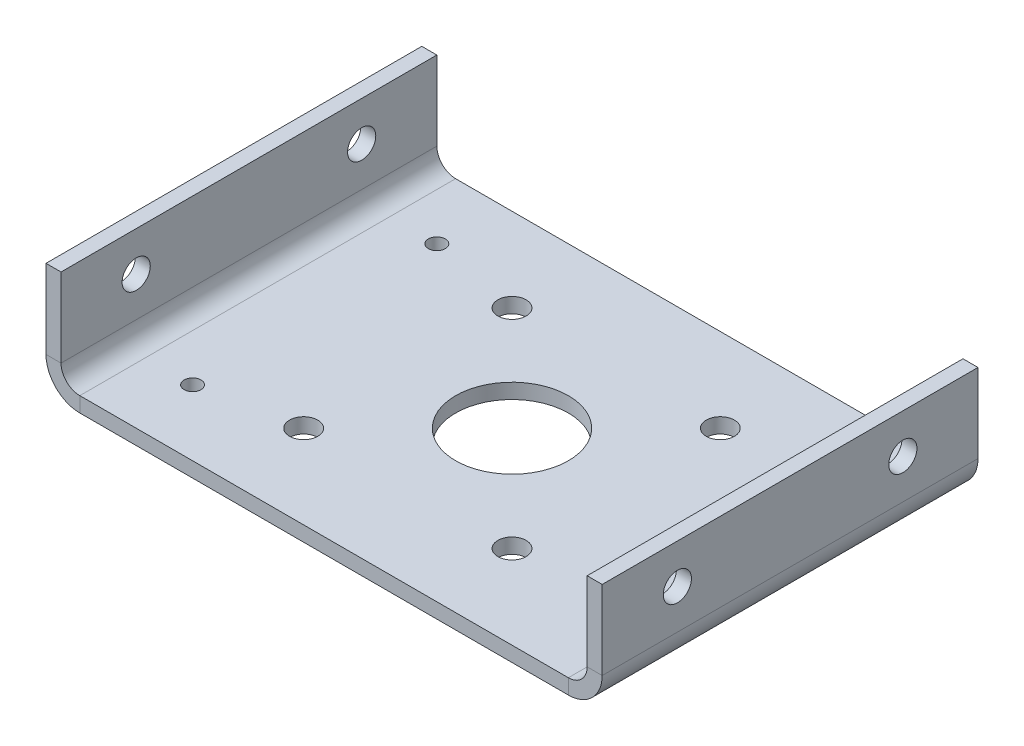
ISO-10303-21;
HEADER;
FILE_DESCRIPTION(('STEP AP214'),'2;1');
FILE_NAME('part.step','',(''),(''),'','','');
FILE_SCHEMA(('AUTOMOTIVE_DESIGN { 1 0 10303 214 1 1 1 1 }'));
ENDSEC;
DATA;
#1=APPLICATION_CONTEXT('core data for automotive mechanical design processes');
#2=APPLICATION_PROTOCOL_DEFINITION('international standard','automotive_design',2000,#1);
#3=PRODUCT_CONTEXT('',#1,'mechanical');
#4=PRODUCT('Part','Part','',(#3));
#5=PRODUCT_RELATED_PRODUCT_CATEGORY('part','',(#4));
#6=PRODUCT_DEFINITION_FORMATION('','',#4);
#7=PRODUCT_DEFINITION_CONTEXT('part definition',#1,'design');
#8=PRODUCT_DEFINITION('design','',#6,#7);
#9=PRODUCT_DEFINITION_SHAPE('','',#8);
#10=(LENGTH_UNIT() NAMED_UNIT(*) SI_UNIT(.MILLI.,.METRE.));
#11=(NAMED_UNIT(*) PLANE_ANGLE_UNIT() SI_UNIT($,.RADIAN.));
#12=(NAMED_UNIT(*) SI_UNIT($,.STERADIAN.) SOLID_ANGLE_UNIT());
#13=UNCERTAINTY_MEASURE_WITH_UNIT(LENGTH_MEASURE(1.E-05),#10,'distance_accuracy_value','');
#14=(GEOMETRIC_REPRESENTATION_CONTEXT(3) GLOBAL_UNCERTAINTY_ASSIGNED_CONTEXT((#13)) GLOBAL_UNIT_ASSIGNED_CONTEXT((#10,
#11,#12)) REPRESENTATION_CONTEXT('',''));
#15=CARTESIAN_POINT('',(0.,0.,0.));
#16=DIRECTION('',(0.,0.,1.));
#17=DIRECTION('',(1.,0.,0.));
#18=AXIS2_PLACEMENT_3D('',#15,#16,#17);
#19=CARTESIAN_POINT('',(0.,-8.,0.));
#20=DIRECTION('',(0.,-1.,0.));
#21=DIRECTION('',(0.,0.,-1.));
#22=AXIS2_PLACEMENT_3D('',#19,#20,#21);
#23=PLANE('',#22);
#24=CARTESIAN_POINT('',(-55.4371716450253,-8.,-55.4371716450253));
#25=DIRECTION('',(0.,1.,0.));
#26=DIRECTION('',(0.,0.,1.));
#27=AXIS2_PLACEMENT_3D('',#24,#25,#26);
#28=CIRCLE('',#27,7.5);
#29=CARTESIAN_POINT('',(-55.4371716450253,-8.,-47.9371716450253));
#30=VERTEX_POINT('',#29);
#31=EDGE_CURVE('E393',#30,#30,#28,.T.);
#32=ORIENTED_EDGE('',*,*,#31,.T.);
#33=EDGE_LOOP('',(#32));
#34=FACE_BOUND('',#33,.T.);
#35=CARTESIAN_POINT('',(-105.,-8.,64.9999999999908));
#36=DIRECTION('',(0.,1.,0.));
#37=DIRECTION('',(0.,0.,1.));
#38=AXIS2_PLACEMENT_3D('',#35,#36,#37);
#39=CIRCLE('',#38,4.50000000000001);
#40=CARTESIAN_POINT('',(-105.,-8.,69.4999999999908));
#41=VERTEX_POINT('',#40);
#42=EDGE_CURVE('E378',#41,#41,#39,.T.);
#43=ORIENTED_EDGE('',*,*,#42,.T.);
#44=EDGE_LOOP('',(#43));
#45=FACE_BOUND('',#44,.T.);
#46=CARTESIAN_POINT('',(55.4371716450253,-8.,-55.4371716450253));
#47=DIRECTION('',(0.,-1.,0.));
#48=DIRECTION('',(0.,0.,1.));
#49=AXIS2_PLACEMENT_3D('',#46,#47,#48);
#50=CIRCLE('',#49,7.5);
#51=CARTESIAN_POINT('',(55.4371716450253,-8.,-47.9371716450253));
#52=VERTEX_POINT('',#51);
#53=EDGE_CURVE('E368',#52,#52,#50,.T.);
#54=ORIENTED_EDGE('',*,*,#53,.F.);
#55=EDGE_LOOP('',(#54));
#56=FACE_BOUND('',#55,.T.);
#57=CARTESIAN_POINT('',(-105.,-8.,-64.9999999999908));
#58=DIRECTION('',(0.,-1.,0.));
#59=DIRECTION('',(0.,0.,-1.));
#60=AXIS2_PLACEMENT_3D('',#57,#58,#59);
#61=CIRCLE('',#60,4.50000000000001);
#62=CARTESIAN_POINT('',(-105.,-8.,-69.4999999999908));
#63=VERTEX_POINT('',#62);
#64=EDGE_CURVE('E363',#63,#63,#61,.T.);
#65=ORIENTED_EDGE('',*,*,#64,.F.);
#66=EDGE_LOOP('',(#65));
#67=FACE_BOUND('',#66,.T.);
#68=CARTESIAN_POINT('',(55.4371716450253,-8.,55.4371716450253));
#69=DIRECTION('',(0.,1.,0.));
#70=DIRECTION('',(0.,0.,-1.));
#71=AXIS2_PLACEMENT_3D('',#68,#69,#70);
#72=CIRCLE('',#71,7.5);
#73=CARTESIAN_POINT('',(55.4371716450253,-8.,47.9371716450253));
#74=VERTEX_POINT('',#73);
#75=EDGE_CURVE('E351',#74,#74,#72,.T.);
#76=ORIENTED_EDGE('',*,*,#75,.T.);
#77=EDGE_LOOP('',(#76));
#78=FACE_BOUND('',#77,.T.);
#79=CARTESIAN_POINT('',(-55.4371716450253,-8.,55.4371716450253));
#80=DIRECTION('',(0.,-1.,0.));
#81=DIRECTION('',(0.,0.,-1.));
#82=AXIS2_PLACEMENT_3D('',#79,#80,#81);
#83=CIRCLE('',#82,7.5);
#84=CARTESIAN_POINT('',(-55.4371716450253,-8.,47.9371716450253));
#85=VERTEX_POINT('',#84);
#86=EDGE_CURVE('E346',#85,#85,#83,.T.);
#87=ORIENTED_EDGE('',*,*,#86,.F.);
#88=EDGE_LOOP('',(#87));
#89=FACE_BOUND('',#88,.T.);
#90=CARTESIAN_POINT('',(0.,-8.,0.));
#91=DIRECTION('',(0.,-1.,0.));
#92=DIRECTION('',(0.,0.,-1.));
#93=AXIS2_PLACEMENT_3D('',#90,#91,#92);
#94=CIRCLE('',#93,30.);
#95=CARTESIAN_POINT('',(0.,-8.,-30.));
#96=VERTEX_POINT('',#95);
#97=EDGE_CURVE('E341',#96,#96,#94,.T.);
#98=ORIENTED_EDGE('',*,*,#97,.F.);
#99=EDGE_LOOP('',(#98));
#100=FACE_BOUND('',#99,.T.);
#101=DIRECTION('',(-1.,0.,0.));
#102=VECTOR('',#101,1.);
#103=CARTESIAN_POINT('',(-148.,-8.,-100.));
#104=LINE('',#103,#102);
#105=CARTESIAN_POINT('',(130.,-8.00000000000002,-100.));
#106=VERTEX_POINT('',#105);
#107=CARTESIAN_POINT('',(-130.,-8.,-100.));
#108=VERTEX_POINT('',#107);
#109=EDGE_CURVE('E93',#106,#108,#104,.T.);
#110=ORIENTED_EDGE('',*,*,#109,.F.);
#111=DIRECTION('',(0.,0.,-1.));
#112=VECTOR('',#111,1.);
#113=CARTESIAN_POINT('',(130.,-8.00000000000002,-100.));
#114=LINE('',#113,#112);
#115=CARTESIAN_POINT('',(130.,-8.,100.));
#116=VERTEX_POINT('',#115);
#117=EDGE_CURVE('E229',#106,#116,#114,.F.);
#118=ORIENTED_EDGE('',*,*,#117,.T.);
#119=DIRECTION('',(1.,0.,0.));
#120=VECTOR('',#119,1.);
#121=CARTESIAN_POINT('',(-148.,-8.,100.));
#122=LINE('',#121,#120);
#123=CARTESIAN_POINT('',(-130.,-8.00000000000002,100.));
#124=VERTEX_POINT('',#123);
#125=EDGE_CURVE('E13',#124,#116,#122,.T.);
#126=ORIENTED_EDGE('',*,*,#125,.F.);
#127=DIRECTION('',(0.,0.,1.));
#128=VECTOR('',#127,1.);
#129=CARTESIAN_POINT('',(-130.,-8.00000000000002,100.));
#130=LINE('',#129,#128);
#131=EDGE_CURVE('E300',#124,#108,#130,.F.);
#132=ORIENTED_EDGE('',*,*,#131,.T.);
#133=EDGE_LOOP('',(#110,#118,#126,#132));
#134=FACE_BOUND('',#133,.T.);
#135=ADVANCED_FACE('F83',(#34,#45,#56,#67,#78,#89,#100,#134),#23,.T.);
#136=CARTESIAN_POINT('',(0.,0.,0.));
#137=DIRECTION('',(0.,-1.,0.));
#138=DIRECTION('',(0.,0.,-1.));
#139=AXIS2_PLACEMENT_3D('',#136,#137,#138);
#140=PLANE('',#139);
#141=CARTESIAN_POINT('',(-55.4371716450253,0.,-55.4371716450253));
#142=DIRECTION('',(0.,-1.,0.));
#143=DIRECTION('',(0.,0.,-1.));
#144=AXIS2_PLACEMENT_3D('',#141,#142,#143);
#145=CIRCLE('',#144,7.5);
#146=CARTESIAN_POINT('',(-55.4371716450253,0.,-62.9371716450253));
#147=VERTEX_POINT('',#146);
#148=EDGE_CURVE('E87',#147,#147,#145,.F.);
#149=ORIENTED_EDGE('',*,*,#148,.F.);
#150=EDGE_LOOP('',(#149));
#151=FACE_BOUND('',#150,.T.);
#152=CARTESIAN_POINT('',(-105.,0.,64.9999999999908));
#153=DIRECTION('',(0.,-1.,0.));
#154=DIRECTION('',(0.,0.,-1.));
#155=AXIS2_PLACEMENT_3D('',#152,#153,#154);
#156=CIRCLE('',#155,4.50000000000001);
#157=CARTESIAN_POINT('',(-105.,0.,60.4999999999908));
#158=VERTEX_POINT('',#157);
#159=EDGE_CURVE('E374',#158,#158,#156,.F.);
#160=ORIENTED_EDGE('',*,*,#159,.F.);
#161=EDGE_LOOP('',(#160));
#162=FACE_BOUND('',#161,.T.);
#163=CARTESIAN_POINT('',(55.4371716450253,0.,-55.4371716450253));
#164=DIRECTION('',(0.,-1.,0.));
#165=DIRECTION('',(0.,0.,-1.));
#166=AXIS2_PLACEMENT_3D('',#163,#164,#165);
#167=CIRCLE('',#166,7.5);
#168=CARTESIAN_POINT('',(55.4371716450253,0.,-62.9371716450253));
#169=VERTEX_POINT('',#168);
#170=EDGE_CURVE('E364',#169,#169,#167,.T.);
#171=ORIENTED_EDGE('',*,*,#170,.T.);
#172=EDGE_LOOP('',(#171));
#173=FACE_BOUND('',#172,.T.);
#174=CARTESIAN_POINT('',(-105.,0.,-64.9999999999908));
#175=DIRECTION('',(0.,-1.,0.));
#176=DIRECTION('',(0.,0.,-1.));
#177=AXIS2_PLACEMENT_3D('',#174,#175,#176);
#178=CIRCLE('',#177,4.50000000000001);
#179=CARTESIAN_POINT('',(-105.,0.,-69.4999999999908));
#180=VERTEX_POINT('',#179);
#181=EDGE_CURVE('E358',#180,#180,#178,.T.);
#182=ORIENTED_EDGE('',*,*,#181,.T.);
#183=EDGE_LOOP('',(#182));
#184=FACE_BOUND('',#183,.T.);
#185=CARTESIAN_POINT('',(55.4371716450253,0.,55.4371716450253));
#186=DIRECTION('',(0.,-1.,0.));
#187=DIRECTION('',(0.,0.,-1.));
#188=AXIS2_PLACEMENT_3D('',#185,#186,#187);
#189=CIRCLE('',#188,7.5);
#190=CARTESIAN_POINT('',(55.4371716450253,0.,47.9371716450253));
#191=VERTEX_POINT('',#190);
#192=EDGE_CURVE('E347',#191,#191,#189,.F.);
#193=ORIENTED_EDGE('',*,*,#192,.F.);
#194=EDGE_LOOP('',(#193));
#195=FACE_BOUND('',#194,.T.);
#196=CARTESIAN_POINT('',(-55.4371716450253,0.,55.4371716450253));
#197=DIRECTION('',(0.,-1.,0.));
#198=DIRECTION('',(0.,0.,-1.));
#199=AXIS2_PLACEMENT_3D('',#196,#197,#198);
#200=CIRCLE('',#199,7.5);
#201=CARTESIAN_POINT('',(-55.4371716450253,0.,47.9371716450253));
#202=VERTEX_POINT('',#201);
#203=EDGE_CURVE('E342',#202,#202,#200,.T.);
#204=ORIENTED_EDGE('',*,*,#203,.T.);
#205=EDGE_LOOP('',(#204));
#206=FACE_BOUND('',#205,.T.);
#207=CARTESIAN_POINT('',(0.,0.,0.));
#208=DIRECTION('',(0.,-1.,0.));
#209=DIRECTION('',(0.,0.,-1.));
#210=AXIS2_PLACEMENT_3D('',#207,#208,#209);
#211=CIRCLE('',#210,30.);
#212=CARTESIAN_POINT('',(0.,0.,-30.));
#213=VERTEX_POINT('',#212);
#214=EDGE_CURVE('E228',#213,#213,#211,.T.);
#215=ORIENTED_EDGE('',*,*,#214,.T.);
#216=EDGE_LOOP('',(#215));
#217=FACE_BOUND('',#216,.T.);
#218=DIRECTION('',(0.,0.,-1.));
#219=VECTOR('',#218,1.);
#220=CARTESIAN_POINT('',(130.,0.,-100.));
#221=LINE('',#220,#219);
#222=CARTESIAN_POINT('',(130.,0.,-100.));
#223=VERTEX_POINT('',#222);
#224=CARTESIAN_POINT('',(130.,0.,100.));
#225=VERTEX_POINT('',#224);
#226=EDGE_CURVE('E244',#223,#225,#221,.F.);
#227=ORIENTED_EDGE('',*,*,#226,.F.);
#228=DIRECTION('',(-1.,0.,0.));
#229=VECTOR('',#228,1.);
#230=CARTESIAN_POINT('',(-148.,0.,-100.));
#231=LINE('',#230,#229);
#232=CARTESIAN_POINT('',(-130.,0.,-100.));
#233=VERTEX_POINT('',#232);
#234=EDGE_CURVE('E324',#223,#233,#231,.T.);
#235=ORIENTED_EDGE('',*,*,#234,.T.);
#236=DIRECTION('',(0.,0.,1.));
#237=VECTOR('',#236,1.);
#238=CARTESIAN_POINT('',(-130.,0.,100.));
#239=LINE('',#238,#237);
#240=CARTESIAN_POINT('',(-130.,0.,100.));
#241=VERTEX_POINT('',#240);
#242=EDGE_CURVE('E315',#241,#233,#239,.F.);
#243=ORIENTED_EDGE('',*,*,#242,.F.);
#244=DIRECTION('',(1.,0.,0.));
#245=VECTOR('',#244,1.);
#246=CARTESIAN_POINT('',(-148.,0.,100.));
#247=LINE('',#246,#245);
#248=EDGE_CURVE('E330',#241,#225,#247,.T.);
#249=ORIENTED_EDGE('',*,*,#248,.T.);
#250=EDGE_LOOP('',(#227,#235,#243,#249));
#251=FACE_BOUND('',#250,.T.);
#252=ADVANCED_FACE('F453',(#151,#162,#173,#184,#195,#206,#217,#251),#140,.F.);
#253=CARTESIAN_POINT('',(-148.,-8.,-100.));
#254=DIRECTION('',(0.,0.,-1.));
#255=DIRECTION('',(-1.,0.,0.));
#256=AXIS2_PLACEMENT_3D('',#253,#254,#255);
#257=PLANE('',#256);
#258=ORIENTED_EDGE('',*,*,#234,.F.);
#259=DIRECTION('',(0.,-1.,0.));
#260=VECTOR('',#259,1.);
#261=CARTESIAN_POINT('',(130.,0.,-100.));
#262=LINE('',#261,#260);
#263=EDGE_CURVE('E236',#223,#106,#262,.T.);
#264=ORIENTED_EDGE('',*,*,#263,.T.);
#265=ORIENTED_EDGE('',*,*,#109,.T.);
#266=DIRECTION('',(0.,-1.,0.));
#267=VECTOR('',#266,1.);
#268=CARTESIAN_POINT('',(-130.,0.,-100.));
#269=LINE('',#268,#267);
#270=EDGE_CURVE('E321',#233,#108,#269,.T.);
#271=ORIENTED_EDGE('',*,*,#270,.F.);
#272=EDGE_LOOP('',(#258,#264,#265,#271));
#273=FACE_BOUND('',#272,.T.);
#274=ADVANCED_FACE('F85',(#273),#257,.T.);
#275=CARTESIAN_POINT('',(-148.,-8.,100.));
#276=DIRECTION('',(0.,0.,1.));
#277=DIRECTION('',(1.,0.,0.));
#278=AXIS2_PLACEMENT_3D('',#275,#276,#277);
#279=PLANE('',#278);
#280=DIRECTION('',(0.,-1.,0.));
#281=VECTOR('',#280,1.);
#282=CARTESIAN_POINT('',(130.,0.,100.));
#283=LINE('',#282,#281);
#284=EDGE_CURVE('E251',#225,#116,#283,.T.);
#285=ORIENTED_EDGE('',*,*,#284,.F.);
#286=ORIENTED_EDGE('',*,*,#248,.F.);
#287=DIRECTION('',(0.,-1.,0.));
#288=VECTOR('',#287,1.);
#289=CARTESIAN_POINT('',(-130.,0.,100.));
#290=LINE('',#289,#288);
#291=EDGE_CURVE('E307',#241,#124,#290,.T.);
#292=ORIENTED_EDGE('',*,*,#291,.T.);
#293=ORIENTED_EDGE('',*,*,#125,.T.);
#294=EDGE_LOOP('',(#285,#286,#292,#293));
#295=FACE_BOUND('',#294,.T.);
#296=ADVANCED_FACE('F465',(#295),#279,.T.);
#297=CARTESIAN_POINT('',(-130.,9.99999999999999,-100.));
#298=DIRECTION('',(0.,0.,-1.));
#299=DIRECTION('',(-1.,0.,0.));
#300=AXIS2_PLACEMENT_3D('',#297,#298,#299);
#301=PLANE('',#300);
#302=DIRECTION('',(1.,0.,0.));
#303=VECTOR('',#302,1.);
#304=CARTESIAN_POINT('',(-148.,9.99999999999992,-100.));
#305=LINE('',#304,#303);
#306=CARTESIAN_POINT('',(-140.,9.99999999999995,-100.));
#307=VERTEX_POINT('',#306);
#308=CARTESIAN_POINT('',(-148.,9.99999999999992,-100.));
#309=VERTEX_POINT('',#308);
#310=EDGE_CURVE('E254',#307,#309,#305,.F.);
#311=ORIENTED_EDGE('',*,*,#310,.F.);
#312=CARTESIAN_POINT('',(-130.,9.99999999999999,-100.));
#313=DIRECTION('',(0.,0.,1.));
#314=DIRECTION('',(1.,0.,0.));
#315=AXIS2_PLACEMENT_3D('',#312,#313,#314);
#316=CIRCLE('',#315,10.);
#317=EDGE_CURVE('E311',#233,#307,#316,.F.);
#318=ORIENTED_EDGE('',*,*,#317,.F.);
#319=ORIENTED_EDGE('',*,*,#270,.T.);
#320=CARTESIAN_POINT('',(-130.,9.99999999999999,-100.));
#321=DIRECTION('',(0.,0.,1.));
#322=DIRECTION('',(1.,0.,0.));
#323=AXIS2_PLACEMENT_3D('',#320,#321,#322);
#324=CIRCLE('',#323,18.);
#325=EDGE_CURVE('E101',#108,#309,#324,.F.);
#326=ORIENTED_EDGE('',*,*,#325,.T.);
#327=EDGE_LOOP('',(#311,#318,#319,#326));
#328=FACE_BOUND('',#327,.T.);
#329=ADVANCED_FACE('F467',(#328),#301,.T.);
#330=CARTESIAN_POINT('',(-130.,9.99999999999999,100.));
#331=DIRECTION('',(0.,0.,-1.));
#332=DIRECTION('',(-1.,0.,0.));
#333=AXIS2_PLACEMENT_3D('',#330,#331,#332);
#334=PLANE('',#333);
#335=CARTESIAN_POINT('',(-130.,9.99999999999999,100.));
#336=DIRECTION('',(0.,0.,1.));
#337=DIRECTION('',(1.,0.,0.));
#338=AXIS2_PLACEMENT_3D('',#335,#336,#337);
#339=CIRCLE('',#338,10.);
#340=CARTESIAN_POINT('',(-140.,9.99999999999995,100.));
#341=VERTEX_POINT('',#340);
#342=EDGE_CURVE('E262',#341,#241,#339,.T.);
#343=ORIENTED_EDGE('',*,*,#342,.F.);
#344=DIRECTION('',(1.,0.,0.));
#345=VECTOR('',#344,1.);
#346=CARTESIAN_POINT('',(-140.,9.99999999999995,100.));
#347=LINE('',#346,#345);
#348=CARTESIAN_POINT('',(-148.,9.99999999999992,100.));
#349=VERTEX_POINT('',#348);
#350=EDGE_CURVE('E290',#341,#349,#347,.F.);
#351=ORIENTED_EDGE('',*,*,#350,.T.);
#352=CARTESIAN_POINT('',(-130.,9.99999999999999,100.));
#353=DIRECTION('',(0.,0.,1.));
#354=DIRECTION('',(1.,0.,0.));
#355=AXIS2_PLACEMENT_3D('',#352,#353,#354);
#356=CIRCLE('',#355,18.);
#357=EDGE_CURVE('E304',#349,#124,#356,.T.);
#358=ORIENTED_EDGE('',*,*,#357,.T.);
#359=ORIENTED_EDGE('',*,*,#291,.F.);
#360=EDGE_LOOP('',(#343,#351,#358,#359));
#361=FACE_BOUND('',#360,.T.);
#362=ADVANCED_FACE('F463',(#361),#334,.F.);
#363=CARTESIAN_POINT('',(-130.,9.99999999999999,100.));
#364=DIRECTION('',(0.,0.,1.));
#365=DIRECTION('',(-1.,0.,0.));
#366=AXIS2_PLACEMENT_3D('',#363,#364,#365);
#367=CYLINDRICAL_SURFACE('',#366,18.);
#368=ORIENTED_EDGE('',*,*,#131,.F.);
#369=ORIENTED_EDGE('',*,*,#357,.F.);
#370=DIRECTION('',(0.,0.,1.));
#371=VECTOR('',#370,1.);
#372=CARTESIAN_POINT('',(-148.,9.99999999999992,-100.));
#373=LINE('',#372,#371);
#374=EDGE_CURVE('E287',#349,#309,#373,.F.);
#375=ORIENTED_EDGE('',*,*,#374,.T.);
#376=ORIENTED_EDGE('',*,*,#325,.F.);
#377=EDGE_LOOP('',(#368,#369,#375,#376));
#378=FACE_BOUND('',#377,.T.);
#379=ADVANCED_FACE('F521',(#378),#367,.T.);
#380=CARTESIAN_POINT('',(-130.,9.99999999999999,100.));
#381=DIRECTION('',(0.,0.,1.));
#382=DIRECTION('',(-1.,0.,0.));
#383=AXIS2_PLACEMENT_3D('',#380,#381,#382);
#384=CYLINDRICAL_SURFACE('',#383,10.);
#385=ORIENTED_EDGE('',*,*,#242,.T.);
#386=ORIENTED_EDGE('',*,*,#317,.T.);
#387=DIRECTION('',(0.,0.,1.));
#388=VECTOR('',#387,1.);
#389=CARTESIAN_POINT('',(-140.,9.99999999999995,-100.));
#390=LINE('',#389,#388);
#391=EDGE_CURVE('E294',#307,#341,#390,.T.);
#392=ORIENTED_EDGE('',*,*,#391,.T.);
#393=ORIENTED_EDGE('',*,*,#342,.T.);
#394=EDGE_LOOP('',(#385,#386,#392,#393));
#395=FACE_BOUND('',#394,.T.);
#396=ADVANCED_FACE('F485',(#395),#384,.F.);
#397=CARTESIAN_POINT('',(-148.,0.,-100.));
#398=DIRECTION('',(0.,0.,1.));
#399=DIRECTION('',(1.,0.,0.));
#400=AXIS2_PLACEMENT_3D('',#397,#398,#399);
#401=PLANE('',#400);
#402=ORIENTED_EDGE('',*,*,#310,.T.);
#403=DIRECTION('',(0.,-1.,0.));
#404=VECTOR('',#403,1.);
#405=CARTESIAN_POINT('',(-148.,-5.80908318745198E-13,-100.));
#406=LINE('',#405,#404);
#407=CARTESIAN_POINT('',(-148.,52.,-100.));
#408=VERTEX_POINT('',#407);
#409=EDGE_CURVE('E273',#408,#309,#406,.T.);
#410=ORIENTED_EDGE('',*,*,#409,.F.);
#411=DIRECTION('',(1.,0.,0.));
#412=VECTOR('',#411,1.);
#413=CARTESIAN_POINT('',(-148.,52.,-100.));
#414=LINE('',#413,#412);
#415=CARTESIAN_POINT('',(-140.,52.,-100.));
#416=VERTEX_POINT('',#415);
#417=EDGE_CURVE('E263',#408,#416,#414,.T.);
#418=ORIENTED_EDGE('',*,*,#417,.T.);
#419=DIRECTION('',(0.,1.,0.));
#420=VECTOR('',#419,1.);
#421=CARTESIAN_POINT('',(-140.,0.,-100.));
#422=LINE('',#421,#420);
#423=EDGE_CURVE('E283',#416,#307,#422,.F.);
#424=ORIENTED_EDGE('',*,*,#423,.T.);
#425=EDGE_LOOP('',(#402,#410,#418,#424));
#426=FACE_BOUND('',#425,.T.);
#427=ADVANCED_FACE('F490',(#426),#401,.F.);
#428=CARTESIAN_POINT('',(-148.,52.,100.));
#429=DIRECTION('',(0.,0.,-1.));
#430=DIRECTION('',(-1.,0.,0.));
#431=AXIS2_PLACEMENT_3D('',#428,#429,#430);
#432=PLANE('',#431);
#433=ORIENTED_EDGE('',*,*,#350,.F.);
#434=DIRECTION('',(0.,-1.,0.));
#435=VECTOR('',#434,1.);
#436=CARTESIAN_POINT('',(-140.,52.,100.));
#437=LINE('',#436,#435);
#438=CARTESIAN_POINT('',(-140.,52.,100.));
#439=VERTEX_POINT('',#438);
#440=EDGE_CURVE('E280',#341,#439,#437,.F.);
#441=ORIENTED_EDGE('',*,*,#440,.T.);
#442=DIRECTION('',(1.,0.,0.));
#443=VECTOR('',#442,1.);
#444=CARTESIAN_POINT('',(-148.,52.,100.));
#445=LINE('',#444,#443);
#446=CARTESIAN_POINT('',(-148.,52.,100.));
#447=VERTEX_POINT('',#446);
#448=EDGE_CURVE('E258',#447,#439,#445,.T.);
#449=ORIENTED_EDGE('',*,*,#448,.F.);
#450=DIRECTION('',(0.,1.,0.));
#451=VECTOR('',#450,1.);
#452=CARTESIAN_POINT('',(-148.,-5.80908318745198E-13,100.));
#453=LINE('',#452,#451);
#454=EDGE_CURVE('E270',#349,#447,#453,.T.);
#455=ORIENTED_EDGE('',*,*,#454,.F.);
#456=EDGE_LOOP('',(#433,#441,#449,#455));
#457=FACE_BOUND('',#456,.T.);
#458=ADVANCED_FACE('F508',(#457),#432,.F.);
#459=CARTESIAN_POINT('',(-148.,-5.80908318745198E-13,0.));
#460=DIRECTION('',(1.,0.,0.));
#461=DIRECTION('',(0.,1.,0.));
#462=AXIS2_PLACEMENT_3D('',#459,#460,#461);
#463=PLANE('',#462);
#464=CARTESIAN_POINT('',(-148.,30.9999999999999,60.));
#465=DIRECTION('',(1.,0.,0.));
#466=DIRECTION('',(0.,-1.,0.));
#467=AXIS2_PLACEMENT_3D('',#464,#465,#466);
#468=CIRCLE('',#467,7.5);
#469=CARTESIAN_POINT('',(-148.,23.4999999999999,60.));
#470=VERTEX_POINT('',#469);
#471=EDGE_CURVE('E377',#470,#470,#468,.T.);
#472=ORIENTED_EDGE('',*,*,#471,.T.);
#473=EDGE_LOOP('',(#472));
#474=FACE_BOUND('',#473,.T.);
#475=CARTESIAN_POINT('',(-148.,30.9999999999999,-60.));
#476=DIRECTION('',(-1.,0.,0.));
#477=DIRECTION('',(0.,-1.,0.));
#478=AXIS2_PLACEMENT_3D('',#475,#476,#477);
#479=CIRCLE('',#478,7.5);
#480=CARTESIAN_POINT('',(-148.,23.4999999999999,-60.));
#481=VERTEX_POINT('',#480);
#482=EDGE_CURVE('E362',#481,#481,#479,.T.);
#483=ORIENTED_EDGE('',*,*,#482,.F.);
#484=EDGE_LOOP('',(#483));
#485=FACE_BOUND('',#484,.T.);
#486=ORIENTED_EDGE('',*,*,#374,.F.);
#487=ORIENTED_EDGE('',*,*,#454,.T.);
#488=DIRECTION('',(0.,0.,-1.));
#489=VECTOR('',#488,1.);
#490=CARTESIAN_POINT('',(-148.,52.,0.));
#491=LINE('',#490,#489);
#492=EDGE_CURVE('E267',#447,#408,#491,.T.);
#493=ORIENTED_EDGE('',*,*,#492,.T.);
#494=ORIENTED_EDGE('',*,*,#409,.T.);
#495=EDGE_LOOP('',(#486,#487,#493,#494));
#496=FACE_BOUND('',#495,.T.);
#497=ADVANCED_FACE('F494',(#474,#485,#496),#463,.F.);
#498=CARTESIAN_POINT('',(-140.,-5.52976468034453E-13,0.));
#499=DIRECTION('',(1.,0.,0.));
#500=DIRECTION('',(0.,1.,0.));
#501=AXIS2_PLACEMENT_3D('',#498,#499,#500);
#502=PLANE('',#501);
#503=CARTESIAN_POINT('',(-140.,30.9999999999999,60.));
#504=DIRECTION('',(1.,0.,0.));
#505=DIRECTION('',(0.,1.,0.));
#506=AXIS2_PLACEMENT_3D('',#503,#504,#505);
#507=CIRCLE('',#506,7.5);
#508=CARTESIAN_POINT('',(-140.,38.4999999999999,60.));
#509=VERTEX_POINT('',#508);
#510=EDGE_CURVE('E372',#509,#509,#507,.F.);
#511=ORIENTED_EDGE('',*,*,#510,.T.);
#512=EDGE_LOOP('',(#511));
#513=FACE_BOUND('',#512,.T.);
#514=CARTESIAN_POINT('',(-140.,30.9999999999999,-60.));
#515=DIRECTION('',(1.,0.,0.));
#516=DIRECTION('',(0.,1.,0.));
#517=AXIS2_PLACEMENT_3D('',#514,#515,#516);
#518=CIRCLE('',#517,7.5);
#519=CARTESIAN_POINT('',(-140.,38.4999999999999,-60.));
#520=VERTEX_POINT('',#519);
#521=EDGE_CURVE('E356',#520,#520,#518,.T.);
#522=ORIENTED_EDGE('',*,*,#521,.F.);
#523=EDGE_LOOP('',(#522));
#524=FACE_BOUND('',#523,.T.);
#525=ORIENTED_EDGE('',*,*,#440,.F.);
#526=ORIENTED_EDGE('',*,*,#391,.F.);
#527=ORIENTED_EDGE('',*,*,#423,.F.);
#528=DIRECTION('',(0.,0.,1.));
#529=VECTOR('',#528,1.);
#530=CARTESIAN_POINT('',(-140.,52.,-100.));
#531=LINE('',#530,#529);
#532=EDGE_CURVE('E277',#439,#416,#531,.F.);
#533=ORIENTED_EDGE('',*,*,#532,.F.);
#534=EDGE_LOOP('',(#525,#526,#527,#533));
#535=FACE_BOUND('',#534,.T.);
#536=ADVANCED_FACE('F504',(#513,#524,#535),#502,.T.);
#537=CARTESIAN_POINT('',(-148.,52.,-100.));
#538=DIRECTION('',(0.,-1.,0.));
#539=DIRECTION('',(1.,0.,0.));
#540=AXIS2_PLACEMENT_3D('',#537,#538,#539);
#541=PLANE('',#540);
#542=ORIENTED_EDGE('',*,*,#532,.T.);
#543=ORIENTED_EDGE('',*,*,#417,.F.);
#544=ORIENTED_EDGE('',*,*,#492,.F.);
#545=ORIENTED_EDGE('',*,*,#448,.T.);
#546=EDGE_LOOP('',(#542,#543,#544,#545));
#547=FACE_BOUND('',#546,.T.);
#548=ADVANCED_FACE('F500',(#547),#541,.F.);
#549=CARTESIAN_POINT('',(130.,9.99999999999999,100.));
#550=DIRECTION('',(0.,0.,1.));
#551=DIRECTION('',(1.,0.,0.));
#552=AXIS2_PLACEMENT_3D('',#549,#550,#551);
#553=PLANE('',#552);
#554=DIRECTION('',(-1.,0.,0.));
#555=VECTOR('',#554,1.);
#556=CARTESIAN_POINT('',(148.,9.99999999999992,100.));
#557=LINE('',#556,#555);
#558=CARTESIAN_POINT('',(140.,9.99999999999995,100.));
#559=VERTEX_POINT('',#558);
#560=CARTESIAN_POINT('',(148.,9.99999999999992,100.));
#561=VERTEX_POINT('',#560);
#562=EDGE_CURVE('E201',#559,#561,#557,.F.);
#563=ORIENTED_EDGE('',*,*,#562,.F.);
#564=CARTESIAN_POINT('',(130.,9.99999999999999,100.));
#565=DIRECTION('',(0.,0.,-1.));
#566=DIRECTION('',(-1.,0.,0.));
#567=AXIS2_PLACEMENT_3D('',#564,#565,#566);
#568=CIRCLE('',#567,10.);
#569=EDGE_CURVE('E240',#225,#559,#568,.F.);
#570=ORIENTED_EDGE('',*,*,#569,.F.);
#571=ORIENTED_EDGE('',*,*,#284,.T.);
#572=CARTESIAN_POINT('',(130.,9.99999999999999,100.));
#573=DIRECTION('',(0.,0.,-1.));
#574=DIRECTION('',(-1.,0.,0.));
#575=AXIS2_PLACEMENT_3D('',#572,#573,#574);
#576=CIRCLE('',#575,18.);
#577=EDGE_CURVE('E109',#116,#561,#576,.F.);
#578=ORIENTED_EDGE('',*,*,#577,.T.);
#579=EDGE_LOOP('',(#563,#570,#571,#578));
#580=FACE_BOUND('',#579,.T.);
#581=ADVANCED_FACE('F563',(#580),#553,.T.);
#582=CARTESIAN_POINT('',(130.,9.99999999999999,-100.));
#583=DIRECTION('',(0.,0.,1.));
#584=DIRECTION('',(1.,0.,0.));
#585=AXIS2_PLACEMENT_3D('',#582,#583,#584);
#586=PLANE('',#585);
#587=CARTESIAN_POINT('',(130.,9.99999999999999,-100.));
#588=DIRECTION('',(0.,0.,-1.));
#589=DIRECTION('',(-1.,0.,0.));
#590=AXIS2_PLACEMENT_3D('',#587,#588,#589);
#591=CIRCLE('',#590,10.);
#592=CARTESIAN_POINT('',(140.,9.99999999999995,-100.));
#593=VERTEX_POINT('',#592);
#594=EDGE_CURVE('E247',#593,#223,#591,.T.);
#595=ORIENTED_EDGE('',*,*,#594,.F.);
#596=DIRECTION('',(-1.,0.,0.));
#597=VECTOR('',#596,1.);
#598=CARTESIAN_POINT('',(140.,9.99999999999995,-100.));
#599=LINE('',#598,#597);
#600=CARTESIAN_POINT('',(148.,9.99999999999992,-100.));
#601=VERTEX_POINT('',#600);
#602=EDGE_CURVE('E219',#593,#601,#599,.F.);
#603=ORIENTED_EDGE('',*,*,#602,.T.);
#604=CARTESIAN_POINT('',(130.,9.99999999999999,-100.));
#605=DIRECTION('',(0.,0.,-1.));
#606=DIRECTION('',(-1.,0.,0.));
#607=AXIS2_PLACEMENT_3D('',#604,#605,#606);
#608=CIRCLE('',#607,18.);
#609=EDGE_CURVE('E233',#601,#106,#608,.T.);
#610=ORIENTED_EDGE('',*,*,#609,.T.);
#611=ORIENTED_EDGE('',*,*,#263,.F.);
#612=EDGE_LOOP('',(#595,#603,#610,#611));
#613=FACE_BOUND('',#612,.T.);
#614=ADVANCED_FACE('F440',(#613),#586,.F.);
#615=CARTESIAN_POINT('',(130.,9.99999999999999,-100.));
#616=DIRECTION('',(0.,0.,-1.));
#617=DIRECTION('',(1.,0.,0.));
#618=AXIS2_PLACEMENT_3D('',#615,#616,#617);
#619=CYLINDRICAL_SURFACE('',#618,18.);
#620=ORIENTED_EDGE('',*,*,#117,.F.);
#621=ORIENTED_EDGE('',*,*,#609,.F.);
#622=DIRECTION('',(0.,0.,-1.));
#623=VECTOR('',#622,1.);
#624=CARTESIAN_POINT('',(148.,9.99999999999992,100.));
#625=LINE('',#624,#623);
#626=EDGE_CURVE('E216',#601,#561,#625,.F.);
#627=ORIENTED_EDGE('',*,*,#626,.T.);
#628=ORIENTED_EDGE('',*,*,#577,.F.);
#629=EDGE_LOOP('',(#620,#621,#627,#628));
#630=FACE_BOUND('',#629,.T.);
#631=ADVANCED_FACE('F579',(#630),#619,.T.);
#632=CARTESIAN_POINT('',(130.,9.99999999999999,-100.));
#633=DIRECTION('',(0.,0.,-1.));
#634=DIRECTION('',(1.,0.,0.));
#635=AXIS2_PLACEMENT_3D('',#632,#633,#634);
#636=CYLINDRICAL_SURFACE('',#635,10.);
#637=ORIENTED_EDGE('',*,*,#226,.T.);
#638=ORIENTED_EDGE('',*,*,#569,.T.);
#639=DIRECTION('',(0.,0.,-1.));
#640=VECTOR('',#639,1.);
#641=CARTESIAN_POINT('',(140.,9.99999999999995,100.));
#642=LINE('',#641,#640);
#643=EDGE_CURVE('E223',#559,#593,#642,.T.);
#644=ORIENTED_EDGE('',*,*,#643,.T.);
#645=ORIENTED_EDGE('',*,*,#594,.T.);
#646=EDGE_LOOP('',(#637,#638,#644,#645));
#647=FACE_BOUND('',#646,.T.);
#648=ADVANCED_FACE('F435',(#647),#636,.F.);
#649=CARTESIAN_POINT('',(148.,0.,100.));
#650=DIRECTION('',(0.,0.,-1.));
#651=DIRECTION('',(-1.,0.,0.));
#652=AXIS2_PLACEMENT_3D('',#649,#650,#651);
#653=PLANE('',#652);
#654=ORIENTED_EDGE('',*,*,#562,.T.);
#655=DIRECTION('',(0.,-1.,0.));
#656=VECTOR('',#655,1.);
#657=CARTESIAN_POINT('',(148.,-5.80908318745198E-13,100.));
#658=LINE('',#657,#656);
#659=CARTESIAN_POINT('',(148.,52.,100.));
#660=VERTEX_POINT('',#659);
#661=EDGE_CURVE('E180',#660,#561,#658,.T.);
#662=ORIENTED_EDGE('',*,*,#661,.F.);
#663=DIRECTION('',(-1.,0.,0.));
#664=VECTOR('',#663,1.);
#665=CARTESIAN_POINT('',(148.,52.,100.));
#666=LINE('',#665,#664);
#667=CARTESIAN_POINT('',(140.,52.,100.));
#668=VERTEX_POINT('',#667);
#669=EDGE_CURVE('E187',#660,#668,#666,.T.);
#670=ORIENTED_EDGE('',*,*,#669,.T.);
#671=DIRECTION('',(0.,1.,0.));
#672=VECTOR('',#671,1.);
#673=CARTESIAN_POINT('',(140.,0.,100.));
#674=LINE('',#673,#672);
#675=EDGE_CURVE('E213',#668,#559,#674,.F.);
#676=ORIENTED_EDGE('',*,*,#675,.T.);
#677=EDGE_LOOP('',(#654,#662,#670,#676));
#678=FACE_BOUND('',#677,.T.);
#679=ADVANCED_FACE('F200',(#678),#653,.F.);
#680=CARTESIAN_POINT('',(148.,52.,-100.));
#681=DIRECTION('',(0.,0.,1.));
#682=DIRECTION('',(1.,0.,0.));
#683=AXIS2_PLACEMENT_3D('',#680,#681,#682);
#684=PLANE('',#683);
#685=ORIENTED_EDGE('',*,*,#602,.F.);
#686=DIRECTION('',(0.,-1.,0.));
#687=VECTOR('',#686,1.);
#688=CARTESIAN_POINT('',(140.,52.,-100.));
#689=LINE('',#688,#687);
#690=CARTESIAN_POINT('',(140.,52.,-100.));
#691=VERTEX_POINT('',#690);
#692=EDGE_CURVE('E208',#593,#691,#689,.F.);
#693=ORIENTED_EDGE('',*,*,#692,.T.);
#694=DIRECTION('',(-1.,0.,0.));
#695=VECTOR('',#694,1.);
#696=CARTESIAN_POINT('',(148.,52.,-100.));
#697=LINE('',#696,#695);
#698=CARTESIAN_POINT('',(148.,52.,-100.));
#699=VERTEX_POINT('',#698);
#700=EDGE_CURVE('E197',#699,#691,#697,.T.);
#701=ORIENTED_EDGE('',*,*,#700,.F.);
#702=DIRECTION('',(0.,1.,0.));
#703=VECTOR('',#702,1.);
#704=CARTESIAN_POINT('',(148.,-5.80908318745198E-13,-100.));
#705=LINE('',#704,#703);
#706=EDGE_CURVE('E182',#601,#699,#705,.T.);
#707=ORIENTED_EDGE('',*,*,#706,.F.);
#708=EDGE_LOOP('',(#685,#693,#701,#707));
#709=FACE_BOUND('',#708,.T.);
#710=ADVANCED_FACE('F441',(#709),#684,.F.);
#711=CARTESIAN_POINT('',(148.,-5.80908318745198E-13,0.));
#712=DIRECTION('',(-1.,0.,0.));
#713=DIRECTION('',(0.,-1.,0.));
#714=AXIS2_PLACEMENT_3D('',#711,#712,#713);
#715=PLANE('',#714);
#716=CARTESIAN_POINT('',(148.,31.000000000001,60.));
#717=DIRECTION('',(1.,0.,0.));
#718=DIRECTION('',(0.,-1.,0.));
#719=AXIS2_PLACEMENT_3D('',#716,#717,#718);
#720=CIRCLE('',#719,7.5);
#721=CARTESIAN_POINT('',(148.,23.500000000001,60.));
#722=VERTEX_POINT('',#721);
#723=EDGE_CURVE('E373',#722,#722,#720,.T.);
#724=ORIENTED_EDGE('',*,*,#723,.F.);
#725=EDGE_LOOP('',(#724));
#726=FACE_BOUND('',#725,.T.);
#727=CARTESIAN_POINT('',(148.,31.000000000001,-60.));
#728=DIRECTION('',(-1.,0.,0.));
#729=DIRECTION('',(0.,-1.,0.));
#730=AXIS2_PLACEMENT_3D('',#727,#728,#729);
#731=CIRCLE('',#730,7.5);
#732=CARTESIAN_POINT('',(148.,23.500000000001,-60.));
#733=VERTEX_POINT('',#732);
#734=EDGE_CURVE('E357',#733,#733,#731,.T.);
#735=ORIENTED_EDGE('',*,*,#734,.T.);
#736=EDGE_LOOP('',(#735));
#737=FACE_BOUND('',#736,.T.);
#738=ORIENTED_EDGE('',*,*,#626,.F.);
#739=ORIENTED_EDGE('',*,*,#706,.T.);
#740=DIRECTION('',(0.,0.,1.));
#741=VECTOR('',#740,1.);
#742=CARTESIAN_POINT('',(148.,52.,0.));
#743=LINE('',#742,#741);
#744=EDGE_CURVE('E175',#699,#660,#743,.T.);
#745=ORIENTED_EDGE('',*,*,#744,.T.);
#746=ORIENTED_EDGE('',*,*,#661,.T.);
#747=EDGE_LOOP('',(#738,#739,#745,#746));
#748=FACE_BOUND('',#747,.T.);
#749=ADVANCED_FACE('F178',(#726,#737,#748),#715,.F.);
#750=CARTESIAN_POINT('',(140.,-5.52976468034453E-13,0.));
#751=DIRECTION('',(-1.,0.,0.));
#752=DIRECTION('',(0.,-1.,0.));
#753=AXIS2_PLACEMENT_3D('',#750,#751,#752);
#754=PLANE('',#753);
#755=CARTESIAN_POINT('',(140.,31.0000000000009,60.));
#756=DIRECTION('',(-1.,0.,0.));
#757=DIRECTION('',(0.,-1.,0.));
#758=AXIS2_PLACEMENT_3D('',#755,#756,#757);
#759=CIRCLE('',#758,7.5);
#760=CARTESIAN_POINT('',(140.,23.5000000000009,60.));
#761=VERTEX_POINT('',#760);
#762=EDGE_CURVE('E369',#761,#761,#759,.F.);
#763=ORIENTED_EDGE('',*,*,#762,.T.);
#764=EDGE_LOOP('',(#763));
#765=FACE_BOUND('',#764,.T.);
#766=CARTESIAN_POINT('',(140.,31.0000000000009,-60.));
#767=DIRECTION('',(-1.,0.,0.));
#768=DIRECTION('',(0.,-1.,0.));
#769=AXIS2_PLACEMENT_3D('',#766,#767,#768);
#770=CIRCLE('',#769,7.5);
#771=CARTESIAN_POINT('',(140.,23.5000000000009,-60.));
#772=VERTEX_POINT('',#771);
#773=EDGE_CURVE('E352',#772,#772,#770,.T.);
#774=ORIENTED_EDGE('',*,*,#773,.F.);
#775=EDGE_LOOP('',(#774));
#776=FACE_BOUND('',#775,.T.);
#777=ORIENTED_EDGE('',*,*,#692,.F.);
#778=ORIENTED_EDGE('',*,*,#643,.F.);
#779=ORIENTED_EDGE('',*,*,#675,.F.);
#780=DIRECTION('',(0.,0.,-1.));
#781=VECTOR('',#780,1.);
#782=CARTESIAN_POINT('',(140.,52.,100.));
#783=LINE('',#782,#781);
#784=EDGE_CURVE('E192',#691,#668,#783,.F.);
#785=ORIENTED_EDGE('',*,*,#784,.F.);
#786=EDGE_LOOP('',(#777,#778,#779,#785));
#787=FACE_BOUND('',#786,.T.);
#788=ADVANCED_FACE('F431',(#765,#776,#787),#754,.T.);
#789=CARTESIAN_POINT('',(148.,52.,100.));
#790=DIRECTION('',(0.,-1.,0.));
#791=DIRECTION('',(1.,0.,0.));
#792=AXIS2_PLACEMENT_3D('',#789,#790,#791);
#793=PLANE('',#792);
#794=ORIENTED_EDGE('',*,*,#784,.T.);
#795=ORIENTED_EDGE('',*,*,#669,.F.);
#796=ORIENTED_EDGE('',*,*,#744,.F.);
#797=ORIENTED_EDGE('',*,*,#700,.T.);
#798=EDGE_LOOP('',(#794,#795,#796,#797));
#799=FACE_BOUND('',#798,.T.);
#800=ADVANCED_FACE('F190',(#799),#793,.F.);
#801=CARTESIAN_POINT('',(0.,2.,0.));
#802=DIRECTION('',(0.,-1.,0.));
#803=DIRECTION('',(0.,0.,-1.));
#804=AXIS2_PLACEMENT_3D('',#801,#802,#803);
#805=CYLINDRICAL_SURFACE('',#804,30.);
#806=ORIENTED_EDGE('',*,*,#97,.T.);
#807=EDGE_LOOP('',(#806));
#808=FACE_BOUND('',#807,.T.);
#809=ORIENTED_EDGE('',*,*,#214,.F.);
#810=EDGE_LOOP('',(#809));
#811=FACE_BOUND('',#810,.T.);
#812=ADVANCED_FACE('F629',(#808,#811),#805,.F.);
#813=CARTESIAN_POINT('',(-55.4371716450253,2.,55.4371716450253));
#814=DIRECTION('',(0.,-1.,0.));
#815=DIRECTION('',(0.,0.,-1.));
#816=AXIS2_PLACEMENT_3D('',#813,#814,#815);
#817=CYLINDRICAL_SURFACE('',#816,7.5);
#818=ORIENTED_EDGE('',*,*,#86,.T.);
#819=EDGE_LOOP('',(#818));
#820=FACE_BOUND('',#819,.T.);
#821=ORIENTED_EDGE('',*,*,#203,.F.);
#822=EDGE_LOOP('',(#821));
#823=FACE_BOUND('',#822,.T.);
#824=ADVANCED_FACE('F637',(#820,#823),#817,.F.);
#825=CARTESIAN_POINT('',(55.4371716450253,2.,55.4371716450253));
#826=DIRECTION('',(0.,-1.,0.));
#827=DIRECTION('',(0.,0.,-1.));
#828=AXIS2_PLACEMENT_3D('',#825,#826,#827);
#829=CYLINDRICAL_SURFACE('',#828,7.5);
#830=ORIENTED_EDGE('',*,*,#75,.F.);
#831=EDGE_LOOP('',(#830));
#832=FACE_BOUND('',#831,.T.);
#833=ORIENTED_EDGE('',*,*,#192,.T.);
#834=EDGE_LOOP('',(#833));
#835=FACE_BOUND('',#834,.T.);
#836=ADVANCED_FACE('F647',(#832,#835),#829,.F.);
#837=CARTESIAN_POINT('',(148.,31.000000000001,-60.));
#838=DIRECTION('',(-1.,0.,0.));
#839=DIRECTION('',(0.,-1.,0.));
#840=AXIS2_PLACEMENT_3D('',#837,#838,#839);
#841=CYLINDRICAL_SURFACE('',#840,7.5);
#842=ORIENTED_EDGE('',*,*,#773,.T.);
#843=EDGE_LOOP('',(#842));
#844=FACE_BOUND('',#843,.T.);
#845=ORIENTED_EDGE('',*,*,#734,.F.);
#846=EDGE_LOOP('',(#845));
#847=FACE_BOUND('',#846,.T.);
#848=ADVANCED_FACE('F657',(#844,#847),#841,.F.);
#849=ORIENTED_EDGE('',*,*,#521,.T.);
#850=EDGE_LOOP('',(#849));
#851=FACE_BOUND('',#850,.T.);
#852=ORIENTED_EDGE('',*,*,#482,.T.);
#853=EDGE_LOOP('',(#852));
#854=FACE_BOUND('',#853,.T.);
#855=ADVANCED_FACE('F667',(#851,#854),#841,.F.);
#856=CARTESIAN_POINT('',(-105.,2.,-64.9999999999908));
#857=DIRECTION('',(0.,-1.,0.));
#858=DIRECTION('',(0.,0.,-1.));
#859=AXIS2_PLACEMENT_3D('',#856,#857,#858);
#860=CYLINDRICAL_SURFACE('',#859,4.50000000000001);
#861=ORIENTED_EDGE('',*,*,#64,.T.);
#862=EDGE_LOOP('',(#861));
#863=FACE_BOUND('',#862,.T.);
#864=ORIENTED_EDGE('',*,*,#181,.F.);
#865=EDGE_LOOP('',(#864));
#866=FACE_BOUND('',#865,.T.);
#867=ADVANCED_FACE('F677',(#863,#866),#860,.F.);
#868=CARTESIAN_POINT('',(55.4371716450253,2.,-55.4371716450253));
#869=DIRECTION('',(0.,-1.,0.));
#870=DIRECTION('',(0.,0.,-1.));
#871=AXIS2_PLACEMENT_3D('',#868,#869,#870);
#872=CYLINDRICAL_SURFACE('',#871,7.5);
#873=ORIENTED_EDGE('',*,*,#53,.T.);
#874=EDGE_LOOP('',(#873));
#875=FACE_BOUND('',#874,.T.);
#876=ORIENTED_EDGE('',*,*,#170,.F.);
#877=EDGE_LOOP('',(#876));
#878=FACE_BOUND('',#877,.T.);
#879=ADVANCED_FACE('F686',(#875,#878),#872,.F.);
#880=CARTESIAN_POINT('',(148.,31.000000000001,60.));
#881=DIRECTION('',(-1.,0.,0.));
#882=DIRECTION('',(0.,-1.,0.));
#883=AXIS2_PLACEMENT_3D('',#880,#881,#882);
#884=CYLINDRICAL_SURFACE('',#883,7.5);
#885=ORIENTED_EDGE('',*,*,#762,.F.);
#886=EDGE_LOOP('',(#885));
#887=FACE_BOUND('',#886,.T.);
#888=ORIENTED_EDGE('',*,*,#723,.T.);
#889=EDGE_LOOP('',(#888));
#890=FACE_BOUND('',#889,.T.);
#891=ADVANCED_FACE('F696',(#887,#890),#884,.F.);
#892=ORIENTED_EDGE('',*,*,#510,.F.);
#893=EDGE_LOOP('',(#892));
#894=FACE_BOUND('',#893,.T.);
#895=ORIENTED_EDGE('',*,*,#471,.F.);
#896=EDGE_LOOP('',(#895));
#897=FACE_BOUND('',#896,.T.);
#898=ADVANCED_FACE('F706',(#894,#897),#884,.F.);
#899=CARTESIAN_POINT('',(-105.,2.,64.9999999999908));
#900=DIRECTION('',(0.,-1.,0.));
#901=DIRECTION('',(0.,0.,-1.));
#902=AXIS2_PLACEMENT_3D('',#899,#900,#901);
#903=CYLINDRICAL_SURFACE('',#902,4.50000000000001);
#904=ORIENTED_EDGE('',*,*,#42,.F.);
#905=EDGE_LOOP('',(#904));
#906=FACE_BOUND('',#905,.T.);
#907=ORIENTED_EDGE('',*,*,#159,.T.);
#908=EDGE_LOOP('',(#907));
#909=FACE_BOUND('',#908,.T.);
#910=ADVANCED_FACE('F716',(#906,#909),#903,.F.);
#911=CARTESIAN_POINT('',(-55.4371716450253,2.,-55.4371716450253));
#912=DIRECTION('',(0.,-1.,0.));
#913=DIRECTION('',(0.,0.,-1.));
#914=AXIS2_PLACEMENT_3D('',#911,#912,#913);
#915=CYLINDRICAL_SURFACE('',#914,7.5);
#916=ORIENTED_EDGE('',*,*,#31,.F.);
#917=EDGE_LOOP('',(#916));
#918=FACE_BOUND('',#917,.T.);
#919=ORIENTED_EDGE('',*,*,#148,.T.);
#920=EDGE_LOOP('',(#919));
#921=FACE_BOUND('',#920,.T.);
#922=ADVANCED_FACE('F725',(#918,#921),#915,.F.);
#923=CLOSED_SHELL('',(#135,#252,#274,#296,#329,#362,#379,#396,#427,#458,#497,#536,#548,#581,
#614,#631,#648,#679,#710,#749,#788,#800,#812,#824,#836,#848,#855,#867,#879,#891,#898,#910,#922));
#924=MANIFOLD_SOLID_BREP('B2',#923);
#925=ADVANCED_BREP_SHAPE_REPRESENTATION('',(#18,#924),#14);
#926=SHAPE_DEFINITION_REPRESENTATION(#9,#925);
ENDSEC;
END-ISO-10303-21;
